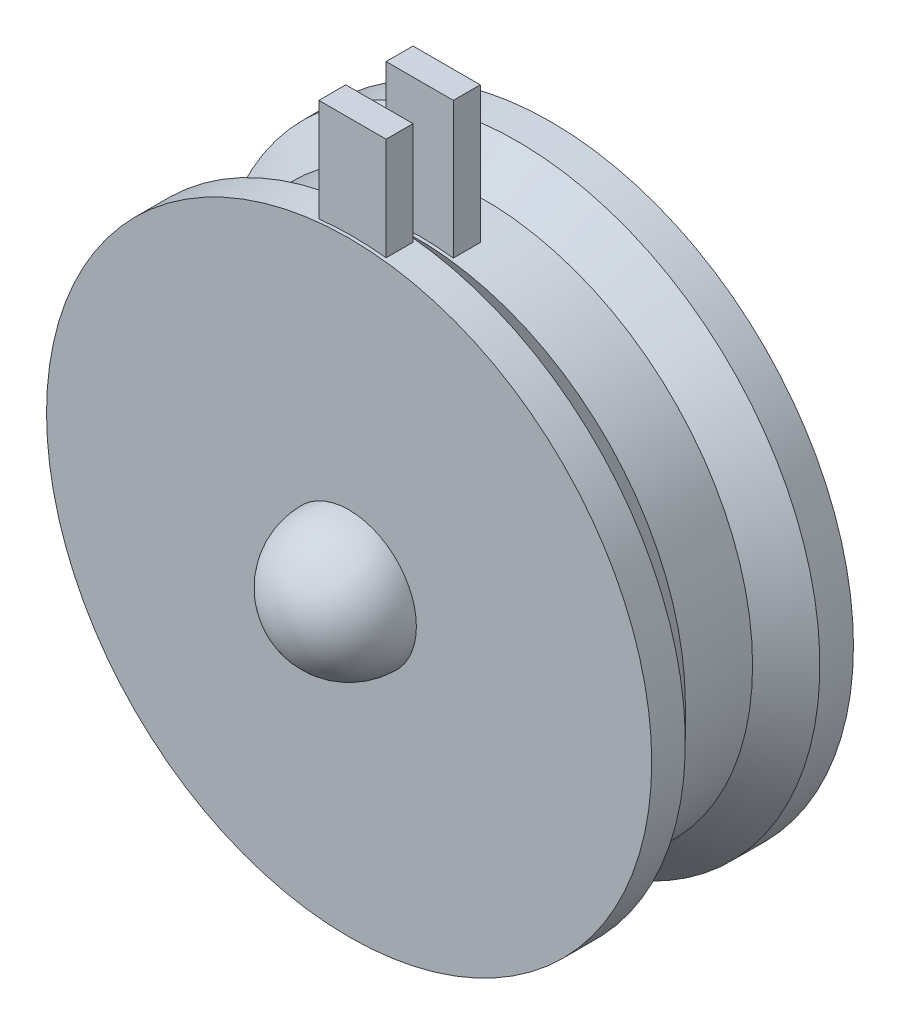
ISO-10303-21;
HEADER;
FILE_DESCRIPTION(('STEP AP214'),'2;1');
FILE_NAME('part.step','',(''),(''),'','','');
FILE_SCHEMA(('AUTOMOTIVE_DESIGN { 1 0 10303 214 1 1 1 1 }'));
ENDSEC;
DATA;
#1=APPLICATION_CONTEXT('core data for automotive mechanical design processes');
#2=APPLICATION_PROTOCOL_DEFINITION('international standard','automotive_design',2000,#1);
#3=PRODUCT_CONTEXT('',#1,'mechanical');
#4=PRODUCT('Part','Part','',(#3));
#5=PRODUCT_RELATED_PRODUCT_CATEGORY('part','',(#4));
#6=PRODUCT_DEFINITION_FORMATION('','',#4);
#7=PRODUCT_DEFINITION_CONTEXT('part definition',#1,'design');
#8=PRODUCT_DEFINITION('design','',#6,#7);
#9=PRODUCT_DEFINITION_SHAPE('','',#8);
#10=(LENGTH_UNIT() NAMED_UNIT(*) SI_UNIT(.MILLI.,.METRE.));
#11=(NAMED_UNIT(*) PLANE_ANGLE_UNIT() SI_UNIT($,.RADIAN.));
#12=(NAMED_UNIT(*) SI_UNIT($,.STERADIAN.) SOLID_ANGLE_UNIT());
#13=UNCERTAINTY_MEASURE_WITH_UNIT(LENGTH_MEASURE(1.E-05),#10,'distance_accuracy_value','');
#14=(GEOMETRIC_REPRESENTATION_CONTEXT(3) GLOBAL_UNCERTAINTY_ASSIGNED_CONTEXT((#13)) GLOBAL_UNIT_ASSIGNED_CONTEXT((#10,
#11,#12)) REPRESENTATION_CONTEXT('',''));
#15=CARTESIAN_POINT('',(0.,0.,0.));
#16=DIRECTION('',(0.,0.,1.));
#17=DIRECTION('',(1.,0.,0.));
#18=AXIS2_PLACEMENT_3D('',#15,#16,#17);
#19=CARTESIAN_POINT('',(0.,0.,3.));
#20=DIRECTION('',(0.,0.,-1.));
#21=DIRECTION('',(-1.,0.,0.));
#22=AXIS2_PLACEMENT_3D('',#19,#20,#21);
#23=CYLINDRICAL_SURFACE('',#22,4.5);
#24=CARTESIAN_POINT('',(0.,0.,2.95));
#25=DIRECTION('',(0.,0.,1.));
#26=DIRECTION('',(1.,0.,0.));
#27=AXIS2_PLACEMENT_3D('',#24,#25,#26);
#28=CIRCLE('',#27,4.5);
#29=CARTESIAN_POINT('',(0.5,4.47213595499958,2.95));
#30=VERTEX_POINT('',#29);
#31=CARTESIAN_POINT('',(-0.5,4.47213595499958,2.95));
#32=VERTEX_POINT('',#31);
#33=EDGE_CURVE('E208',#30,#32,#28,.T.);
#34=ORIENTED_EDGE('',*,*,#33,.T.);
#35=DIRECTION('',(0.,0.,-1.));
#36=VECTOR('',#35,1.);
#37=CARTESIAN_POINT('',(-0.5,4.47213595499958,3.));
#38=LINE('',#37,#36);
#39=CARTESIAN_POINT('',(-0.5,4.47213595499958,2.55));
#40=VERTEX_POINT('',#39);
#41=EDGE_CURVE('E211',#32,#40,#38,.T.);
#42=ORIENTED_EDGE('',*,*,#41,.T.);
#43=CARTESIAN_POINT('',(0.,0.,2.55));
#44=DIRECTION('',(0.,0.,-1.));
#45=DIRECTION('',(-1.,0.,0.));
#46=AXIS2_PLACEMENT_3D('',#43,#44,#45);
#47=CIRCLE('',#46,4.5);
#48=CARTESIAN_POINT('',(0.5,4.47213595499958,2.55));
#49=VERTEX_POINT('',#48);
#50=EDGE_CURVE('E205',#40,#49,#47,.T.);
#51=ORIENTED_EDGE('',*,*,#50,.T.);
#52=DIRECTION('',(0.,0.,-1.));
#53=VECTOR('',#52,1.);
#54=CARTESIAN_POINT('',(0.5,4.47213595499958,3.));
#55=LINE('',#54,#53);
#56=EDGE_CURVE('E198',#30,#49,#55,.T.);
#57=ORIENTED_EDGE('',*,*,#56,.F.);
#58=EDGE_LOOP('',(#34,#42,#51,#57));
#59=FACE_BOUND('',#58,.T.);
#60=CARTESIAN_POINT('',(0.,0.,2.5));
#61=DIRECTION('',(0.,0.,-1.));
#62=DIRECTION('',(-1.,0.,0.));
#63=AXIS2_PLACEMENT_3D('',#60,#61,#62);
#64=CIRCLE('',#63,4.5);
#65=CARTESIAN_POINT('',(-4.5,0.,2.5));
#66=VERTEX_POINT('',#65);
#67=EDGE_CURVE('E177',#66,#66,#64,.T.);
#68=ORIENTED_EDGE('',*,*,#67,.F.);
#69=EDGE_LOOP('',(#68));
#70=FACE_BOUND('',#69,.T.);
#71=CARTESIAN_POINT('',(0.,0.,3.));
#72=DIRECTION('',(0.,0.,1.));
#73=DIRECTION('',(1.,0.,0.));
#74=AXIS2_PLACEMENT_3D('',#71,#72,#73);
#75=CIRCLE('',#74,4.5);
#76=CARTESIAN_POINT('',(4.5,0.,3.));
#77=VERTEX_POINT('',#76);
#78=EDGE_CURVE('E194',#77,#77,#75,.T.);
#79=ORIENTED_EDGE('',*,*,#78,.F.);
#80=EDGE_LOOP('',(#79));
#81=FACE_BOUND('',#80,.T.);
#82=ADVANCED_FACE('F39',(#59,#70,#81),#23,.T.);
#83=CARTESIAN_POINT('',(0.,0.,3.));
#84=DIRECTION('',(0.,0.,1.));
#85=DIRECTION('',(1.,0.,0.));
#86=AXIS2_PLACEMENT_3D('',#83,#84,#85);
#87=PLANE('',#86);
#88=CARTESIAN_POINT('',(0.,0.,3.));
#89=DIRECTION('',(0.,0.,-1.));
#90=DIRECTION('',(-1.,0.,0.));
#91=AXIS2_PLACEMENT_3D('',#88,#89,#90);
#92=CIRCLE('',#91,1.);
#93=CARTESIAN_POINT('',(-1.,0.,3.));
#94=VERTEX_POINT('',#93);
#95=EDGE_CURVE('E166',#94,#94,#92,.T.);
#96=ORIENTED_EDGE('',*,*,#95,.T.);
#97=EDGE_LOOP('',(#96));
#98=FACE_BOUND('',#97,.T.);
#99=ORIENTED_EDGE('',*,*,#78,.T.);
#100=EDGE_LOOP('',(#99));
#101=FACE_BOUND('',#100,.T.);
#102=ADVANCED_FACE('F238',(#98,#101),#87,.T.);
#103=CARTESIAN_POINT('',(0.,0.,2.5));
#104=DIRECTION('',(0.,0.,1.));
#105=DIRECTION('',(1.,0.,0.));
#106=AXIS2_PLACEMENT_3D('',#103,#104,#105);
#107=CONICAL_SURFACE('',#106,4.5,0.78539816339745);
#108=CARTESIAN_POINT('',(0.,0.,2.));
#109=DIRECTION('',(0.,0.,-1.));
#110=DIRECTION('',(-1.,0.,0.));
#111=AXIS2_PLACEMENT_3D('',#108,#109,#110);
#112=CIRCLE('',#111,4.);
#113=CARTESIAN_POINT('',(-4.,0.,2.));
#114=VERTEX_POINT('',#113);
#115=EDGE_CURVE('E189',#114,#114,#112,.T.);
#116=ORIENTED_EDGE('',*,*,#115,.F.);
#117=EDGE_LOOP('',(#116));
#118=FACE_BOUND('',#117,.T.);
#119=ORIENTED_EDGE('',*,*,#67,.T.);
#120=EDGE_LOOP('',(#119));
#121=FACE_BOUND('',#120,.T.);
#122=ADVANCED_FACE('F245',(#118,#121),#107,.T.);
#123=CARTESIAN_POINT('',(0.,0.,0.));
#124=DIRECTION('',(0.,0.,-1.));
#125=DIRECTION('',(-1.,0.,0.));
#126=AXIS2_PLACEMENT_3D('',#123,#124,#125);
#127=CYLINDRICAL_SURFACE('',#126,4.);
#128=CARTESIAN_POINT('',(0.,0.,1.95));
#129=DIRECTION('',(0.,0.,1.));
#130=DIRECTION('',(1.,0.,0.));
#131=AXIS2_PLACEMENT_3D('',#128,#129,#130);
#132=CIRCLE('',#131,4.);
#133=CARTESIAN_POINT('',(0.5,3.96862696659688,1.95));
#134=VERTEX_POINT('',#133);
#135=CARTESIAN_POINT('',(-0.5,3.96862696659688,1.95));
#136=VERTEX_POINT('',#135);
#137=EDGE_CURVE('E48',#134,#136,#132,.T.);
#138=ORIENTED_EDGE('',*,*,#137,.T.);
#139=DIRECTION('',(0.,0.,-1.));
#140=VECTOR('',#139,1.);
#141=CARTESIAN_POINT('',(-0.5,3.96862696659688,0.));
#142=LINE('',#141,#140);
#143=CARTESIAN_POINT('',(-0.5,3.96862696659688,1.55));
#144=VERTEX_POINT('',#143);
#145=EDGE_CURVE('E11',#136,#144,#142,.T.);
#146=ORIENTED_EDGE('',*,*,#145,.T.);
#147=CARTESIAN_POINT('',(0.,0.,1.55));
#148=DIRECTION('',(0.,0.,-1.));
#149=DIRECTION('',(-1.,0.,0.));
#150=AXIS2_PLACEMENT_3D('',#147,#148,#149);
#151=CIRCLE('',#150,4.);
#152=CARTESIAN_POINT('',(0.5,3.96862696659688,1.55));
#153=VERTEX_POINT('',#152);
#154=EDGE_CURVE('E216',#144,#153,#151,.T.);
#155=ORIENTED_EDGE('',*,*,#154,.T.);
#156=DIRECTION('',(0.,0.,-1.));
#157=VECTOR('',#156,1.);
#158=CARTESIAN_POINT('',(0.5,3.96862696659688,0.));
#159=LINE('',#158,#157);
#160=EDGE_CURVE('E108',#134,#153,#159,.T.);
#161=ORIENTED_EDGE('',*,*,#160,.F.);
#162=EDGE_LOOP('',(#138,#146,#155,#161));
#163=FACE_BOUND('',#162,.T.);
#164=CARTESIAN_POINT('',(0.,0.,1.));
#165=DIRECTION('',(0.,0.,-1.));
#166=DIRECTION('',(-1.,0.,0.));
#167=AXIS2_PLACEMENT_3D('',#164,#165,#166);
#168=CIRCLE('',#167,4.);
#169=CARTESIAN_POINT('',(-4.,0.,1.));
#170=VERTEX_POINT('',#169);
#171=EDGE_CURVE('E185',#170,#170,#168,.T.);
#172=ORIENTED_EDGE('',*,*,#171,.F.);
#173=EDGE_LOOP('',(#172));
#174=FACE_BOUND('',#173,.T.);
#175=ORIENTED_EDGE('',*,*,#115,.T.);
#176=EDGE_LOOP('',(#175));
#177=FACE_BOUND('',#176,.T.);
#178=ADVANCED_FACE('F219',(#163,#174,#177),#127,.T.);
#179=CARTESIAN_POINT('',(0.,0.,1.));
#180=DIRECTION('',(0.,0.,-1.));
#181=DIRECTION('',(-1.,0.,0.));
#182=AXIS2_PLACEMENT_3D('',#179,#180,#181);
#183=CONICAL_SURFACE('',#182,4.,0.78539816339745);
#184=CARTESIAN_POINT('',(0.,0.,0.5));
#185=DIRECTION('',(0.,0.,-1.));
#186=DIRECTION('',(-1.,0.,0.));
#187=AXIS2_PLACEMENT_3D('',#184,#185,#186);
#188=CIRCLE('',#187,4.5);
#189=CARTESIAN_POINT('',(-4.5,0.,0.5));
#190=VERTEX_POINT('',#189);
#191=EDGE_CURVE('E181',#190,#190,#188,.T.);
#192=ORIENTED_EDGE('',*,*,#191,.F.);
#193=EDGE_LOOP('',(#192));
#194=FACE_BOUND('',#193,.T.);
#195=ORIENTED_EDGE('',*,*,#171,.T.);
#196=EDGE_LOOP('',(#195));
#197=FACE_BOUND('',#196,.T.);
#198=ADVANCED_FACE('F260',(#194,#197),#183,.T.);
#199=CARTESIAN_POINT('',(0.,0.,0.));
#200=DIRECTION('',(0.,0.,1.));
#201=DIRECTION('',(1.,0.,0.));
#202=AXIS2_PLACEMENT_3D('',#199,#200,#201);
#203=PLANE('',#202);
#204=CARTESIAN_POINT('',(0.,0.,0.));
#205=DIRECTION('',(0.,0.,-1.));
#206=DIRECTION('',(-1.,0.,0.));
#207=AXIS2_PLACEMENT_3D('',#204,#205,#206);
#208=CIRCLE('',#207,1.);
#209=CARTESIAN_POINT('',(-1.,0.,0.));
#210=VERTEX_POINT('',#209);
#211=EDGE_CURVE('E173',#210,#210,#208,.T.);
#212=ORIENTED_EDGE('',*,*,#211,.F.);
#213=EDGE_LOOP('',(#212));
#214=FACE_BOUND('',#213,.T.);
#215=CARTESIAN_POINT('',(0.,0.,0.));
#216=DIRECTION('',(0.,0.,1.));
#217=DIRECTION('',(1.,0.,0.));
#218=AXIS2_PLACEMENT_3D('',#215,#216,#217);
#219=CIRCLE('',#218,4.5);
#220=CARTESIAN_POINT('',(4.5,0.,0.));
#221=VERTEX_POINT('',#220);
#222=EDGE_CURVE('E193',#221,#221,#219,.T.);
#223=ORIENTED_EDGE('',*,*,#222,.F.);
#224=EDGE_LOOP('',(#223));
#225=FACE_BOUND('',#224,.T.);
#226=ADVANCED_FACE('F251',(#214,#225),#203,.F.);
#227=ORIENTED_EDGE('',*,*,#191,.T.);
#228=EDGE_LOOP('',(#227));
#229=FACE_BOUND('',#228,.T.);
#230=ORIENTED_EDGE('',*,*,#222,.T.);
#231=EDGE_LOOP('',(#230));
#232=FACE_BOUND('',#231,.T.);
#233=ADVANCED_FACE('F41',(#229,#232),#23,.T.);
#234=CARTESIAN_POINT('',(0.,0.,0.));
#235=DIRECTION('',(0.,0.,-1.));
#236=DIRECTION('',(1.,0.,0.));
#237=AXIS2_PLACEMENT_3D('',#234,#235,#236);
#238=SPHERICAL_SURFACE('',#237,1.);
#239=ORIENTED_EDGE('',*,*,#211,.T.);
#240=EDGE_LOOP('',(#239));
#241=FACE_BOUND('',#240,.T.);
#242=ADVANCED_FACE('F250',(#241),#238,.T.);
#243=CARTESIAN_POINT('',(0.,0.,3.));
#244=DIRECTION('',(0.,0.,-1.));
#245=DIRECTION('',(1.,0.,0.));
#246=AXIS2_PLACEMENT_3D('',#243,#244,#245);
#247=SPHERICAL_SURFACE('',#246,1.);
#248=ORIENTED_EDGE('',*,*,#95,.F.);
#249=EDGE_LOOP('',(#248));
#250=FACE_BOUND('',#249,.T.);
#251=ADVANCED_FACE('F257',(#250),#247,.T.);
#252=CARTESIAN_POINT('',(-0.5,0.,0.));
#253=DIRECTION('',(-1.,0.,0.));
#254=DIRECTION('',(0.,0.,1.));
#255=AXIS2_PLACEMENT_3D('',#252,#253,#254);
#256=PLANE('',#255);
#257=ORIENTED_EDGE('',*,*,#41,.F.);
#258=DIRECTION('',(0.,-1.,0.));
#259=VECTOR('',#258,1.);
#260=CARTESIAN_POINT('',(-0.5,4.,2.95));
#261=LINE('',#260,#259);
#262=CARTESIAN_POINT('',(-0.5,6.,2.95));
#263=VERTEX_POINT('',#262);
#264=EDGE_CURVE('E151',#263,#32,#261,.T.);
#265=ORIENTED_EDGE('',*,*,#264,.F.);
#266=DIRECTION('',(0.,0.,1.));
#267=VECTOR('',#266,1.);
#268=CARTESIAN_POINT('',(-0.5,6.,2.95));
#269=LINE('',#268,#267);
#270=CARTESIAN_POINT('',(-0.5,6.,2.55));
#271=VERTEX_POINT('',#270);
#272=EDGE_CURVE('E158',#271,#263,#269,.T.);
#273=ORIENTED_EDGE('',*,*,#272,.F.);
#274=DIRECTION('',(0.,1.,0.));
#275=VECTOR('',#274,1.);
#276=CARTESIAN_POINT('',(-0.5,4.,2.55));
#277=LINE('',#276,#275);
#278=EDGE_CURVE('E155',#40,#271,#277,.T.);
#279=ORIENTED_EDGE('',*,*,#278,.F.);
#280=EDGE_LOOP('',(#257,#265,#273,#279));
#281=FACE_BOUND('',#280,.T.);
#282=ADVANCED_FACE('F288',(#281),#256,.T.);
#283=CARTESIAN_POINT('',(0.5,0.,0.));
#284=DIRECTION('',(-1.,0.,0.));
#285=DIRECTION('',(0.,0.,1.));
#286=AXIS2_PLACEMENT_3D('',#283,#284,#285);
#287=PLANE('',#286);
#288=DIRECTION('',(0.,-1.,0.));
#289=VECTOR('',#288,1.);
#290=CARTESIAN_POINT('',(0.5,4.,2.95));
#291=LINE('',#290,#289);
#292=CARTESIAN_POINT('',(0.5,6.,2.95));
#293=VERTEX_POINT('',#292);
#294=EDGE_CURVE('E139',#293,#30,#291,.T.);
#295=ORIENTED_EDGE('',*,*,#294,.T.);
#296=ORIENTED_EDGE('',*,*,#56,.T.);
#297=DIRECTION('',(0.,1.,0.));
#298=VECTOR('',#297,1.);
#299=CARTESIAN_POINT('',(0.5,4.,2.55));
#300=LINE('',#299,#298);
#301=CARTESIAN_POINT('',(0.5,6.,2.55));
#302=VERTEX_POINT('',#301);
#303=EDGE_CURVE('E144',#49,#302,#300,.T.);
#304=ORIENTED_EDGE('',*,*,#303,.T.);
#305=DIRECTION('',(0.,0.,1.));
#306=VECTOR('',#305,1.);
#307=CARTESIAN_POINT('',(0.5,6.,2.95));
#308=LINE('',#307,#306);
#309=EDGE_CURVE('E147',#302,#293,#308,.T.);
#310=ORIENTED_EDGE('',*,*,#309,.T.);
#311=EDGE_LOOP('',(#295,#296,#304,#310));
#312=FACE_BOUND('',#311,.T.);
#313=ADVANCED_FACE('F294',(#312),#287,.F.);
#314=CARTESIAN_POINT('',(-0.5,4.,2.95));
#315=DIRECTION('',(0.,0.,1.));
#316=DIRECTION('',(1.,0.,0.));
#317=AXIS2_PLACEMENT_3D('',#314,#315,#316);
#318=PLANE('',#317);
#319=ORIENTED_EDGE('',*,*,#33,.F.);
#320=ORIENTED_EDGE('',*,*,#294,.F.);
#321=DIRECTION('',(1.,0.,0.));
#322=VECTOR('',#321,1.);
#323=CARTESIAN_POINT('',(-0.5,6.,2.95));
#324=LINE('',#323,#322);
#325=EDGE_CURVE('E163',#263,#293,#324,.T.);
#326=ORIENTED_EDGE('',*,*,#325,.F.);
#327=ORIENTED_EDGE('',*,*,#264,.T.);
#328=EDGE_LOOP('',(#319,#320,#326,#327));
#329=FACE_BOUND('',#328,.T.);
#330=ADVANCED_FACE('F290',(#329),#318,.T.);
#331=CARTESIAN_POINT('',(-0.5,6.,2.95));
#332=DIRECTION('',(0.,1.,0.));
#333=DIRECTION('',(0.,0.,1.));
#334=AXIS2_PLACEMENT_3D('',#331,#332,#333);
#335=PLANE('',#334);
#336=ORIENTED_EDGE('',*,*,#325,.T.);
#337=ORIENTED_EDGE('',*,*,#309,.F.);
#338=DIRECTION('',(1.,0.,0.));
#339=VECTOR('',#338,1.);
#340=CARTESIAN_POINT('',(-0.5,6.,2.55));
#341=LINE('',#340,#339);
#342=EDGE_CURVE('E162',#271,#302,#341,.T.);
#343=ORIENTED_EDGE('',*,*,#342,.F.);
#344=ORIENTED_EDGE('',*,*,#272,.T.);
#345=EDGE_LOOP('',(#336,#337,#343,#344));
#346=FACE_BOUND('',#345,.T.);
#347=ADVANCED_FACE('F293',(#346),#335,.T.);
#348=CARTESIAN_POINT('',(-0.5,4.,2.55));
#349=DIRECTION('',(0.,0.,-1.));
#350=DIRECTION('',(-1.,0.,0.));
#351=AXIS2_PLACEMENT_3D('',#348,#349,#350);
#352=PLANE('',#351);
#353=ORIENTED_EDGE('',*,*,#50,.F.);
#354=ORIENTED_EDGE('',*,*,#278,.T.);
#355=ORIENTED_EDGE('',*,*,#342,.T.);
#356=ORIENTED_EDGE('',*,*,#303,.F.);
#357=EDGE_LOOP('',(#353,#354,#355,#356));
#358=FACE_BOUND('',#357,.T.);
#359=ADVANCED_FACE('F296',(#358),#352,.T.);
#360=CARTESIAN_POINT('',(-0.5,0.,0.));
#361=DIRECTION('',(-1.,0.,0.));
#362=DIRECTION('',(0.,0.,1.));
#363=AXIS2_PLACEMENT_3D('',#360,#361,#362);
#364=PLANE('',#363);
#365=ORIENTED_EDGE('',*,*,#145,.F.);
#366=DIRECTION('',(0.,-1.,0.));
#367=VECTOR('',#366,1.);
#368=CARTESIAN_POINT('',(-0.5,3.5,1.95));
#369=LINE('',#368,#367);
#370=CARTESIAN_POINT('',(-0.5,6.,1.95));
#371=VERTEX_POINT('',#370);
#372=EDGE_CURVE('E127',#371,#136,#369,.T.);
#373=ORIENTED_EDGE('',*,*,#372,.F.);
#374=DIRECTION('',(0.,0.,1.));
#375=VECTOR('',#374,1.);
#376=CARTESIAN_POINT('',(-0.5,6.,1.95));
#377=LINE('',#376,#375);
#378=CARTESIAN_POINT('',(-0.5,6.,1.55));
#379=VERTEX_POINT('',#378);
#380=EDGE_CURVE('E123',#379,#371,#377,.T.);
#381=ORIENTED_EDGE('',*,*,#380,.F.);
#382=DIRECTION('',(0.,1.,0.));
#383=VECTOR('',#382,1.);
#384=CARTESIAN_POINT('',(-0.5,3.5,1.55));
#385=LINE('',#384,#383);
#386=EDGE_CURVE('E117',#144,#379,#385,.T.);
#387=ORIENTED_EDGE('',*,*,#386,.F.);
#388=EDGE_LOOP('',(#365,#373,#381,#387));
#389=FACE_BOUND('',#388,.T.);
#390=ADVANCED_FACE('F222',(#389),#364,.T.);
#391=CARTESIAN_POINT('',(0.5,0.,0.));
#392=DIRECTION('',(-1.,0.,0.));
#393=DIRECTION('',(0.,0.,1.));
#394=AXIS2_PLACEMENT_3D('',#391,#392,#393);
#395=PLANE('',#394);
#396=DIRECTION('',(0.,-1.,0.));
#397=VECTOR('',#396,1.);
#398=CARTESIAN_POINT('',(0.5,3.5,1.95));
#399=LINE('',#398,#397);
#400=CARTESIAN_POINT('',(0.5,6.,1.95));
#401=VERTEX_POINT('',#400);
#402=EDGE_CURVE('E111',#401,#134,#399,.T.);
#403=ORIENTED_EDGE('',*,*,#402,.T.);
#404=ORIENTED_EDGE('',*,*,#160,.T.);
#405=DIRECTION('',(0.,1.,0.));
#406=VECTOR('',#405,1.);
#407=CARTESIAN_POINT('',(0.5,3.5,1.55));
#408=LINE('',#407,#406);
#409=CARTESIAN_POINT('',(0.5,6.,1.55));
#410=VERTEX_POINT('',#409);
#411=EDGE_CURVE('E101',#153,#410,#408,.T.);
#412=ORIENTED_EDGE('',*,*,#411,.T.);
#413=DIRECTION('',(0.,0.,1.));
#414=VECTOR('',#413,1.);
#415=CARTESIAN_POINT('',(0.5,6.,1.95));
#416=LINE('',#415,#414);
#417=EDGE_CURVE('E106',#410,#401,#416,.T.);
#418=ORIENTED_EDGE('',*,*,#417,.T.);
#419=EDGE_LOOP('',(#403,#404,#412,#418));
#420=FACE_BOUND('',#419,.T.);
#421=ADVANCED_FACE('F104',(#420),#395,.F.);
#422=CARTESIAN_POINT('',(-0.5,3.5,1.95));
#423=DIRECTION('',(0.,0.,1.));
#424=DIRECTION('',(1.,0.,0.));
#425=AXIS2_PLACEMENT_3D('',#422,#423,#424);
#426=PLANE('',#425);
#427=ORIENTED_EDGE('',*,*,#137,.F.);
#428=ORIENTED_EDGE('',*,*,#402,.F.);
#429=DIRECTION('',(1.,0.,0.));
#430=VECTOR('',#429,1.);
#431=CARTESIAN_POINT('',(-0.5,6.,1.95));
#432=LINE('',#431,#430);
#433=EDGE_CURVE('E122',#371,#401,#432,.T.);
#434=ORIENTED_EDGE('',*,*,#433,.F.);
#435=ORIENTED_EDGE('',*,*,#372,.T.);
#436=EDGE_LOOP('',(#427,#428,#434,#435));
#437=FACE_BOUND('',#436,.T.);
#438=ADVANCED_FACE('F225',(#437),#426,.T.);
#439=CARTESIAN_POINT('',(-0.5,6.,1.95));
#440=DIRECTION('',(0.,1.,0.));
#441=DIRECTION('',(0.,0.,1.));
#442=AXIS2_PLACEMENT_3D('',#439,#440,#441);
#443=PLANE('',#442);
#444=ORIENTED_EDGE('',*,*,#433,.T.);
#445=ORIENTED_EDGE('',*,*,#417,.F.);
#446=DIRECTION('',(1.,0.,0.));
#447=VECTOR('',#446,1.);
#448=CARTESIAN_POINT('',(-0.5,6.,1.55));
#449=LINE('',#448,#447);
#450=EDGE_CURVE('E114',#379,#410,#449,.T.);
#451=ORIENTED_EDGE('',*,*,#450,.F.);
#452=ORIENTED_EDGE('',*,*,#380,.T.);
#453=EDGE_LOOP('',(#444,#445,#451,#452));
#454=FACE_BOUND('',#453,.T.);
#455=ADVANCED_FACE('F125',(#454),#443,.T.);
#456=CARTESIAN_POINT('',(-0.5,3.5,1.55));
#457=DIRECTION('',(0.,0.,-1.));
#458=DIRECTION('',(-1.,0.,0.));
#459=AXIS2_PLACEMENT_3D('',#456,#457,#458);
#460=PLANE('',#459);
#461=ORIENTED_EDGE('',*,*,#154,.F.);
#462=ORIENTED_EDGE('',*,*,#386,.T.);
#463=ORIENTED_EDGE('',*,*,#450,.T.);
#464=ORIENTED_EDGE('',*,*,#411,.F.);
#465=EDGE_LOOP('',(#461,#462,#463,#464));
#466=FACE_BOUND('',#465,.T.);
#467=ADVANCED_FACE('F115',(#466),#460,.T.);
#468=CLOSED_SHELL('',(#82,#102,#122,#178,#198,#226,#233,#242,#251,#282,#313,#330,#347,#359,#390,
#421,#438,#455,#467));
#469=MANIFOLD_SOLID_BREP('B2',#468);
#470=ADVANCED_BREP_SHAPE_REPRESENTATION('',(#18,#469),#14);
#471=SHAPE_DEFINITION_REPRESENTATION(#9,#470);
ENDSEC;
END-ISO-10303-21;
